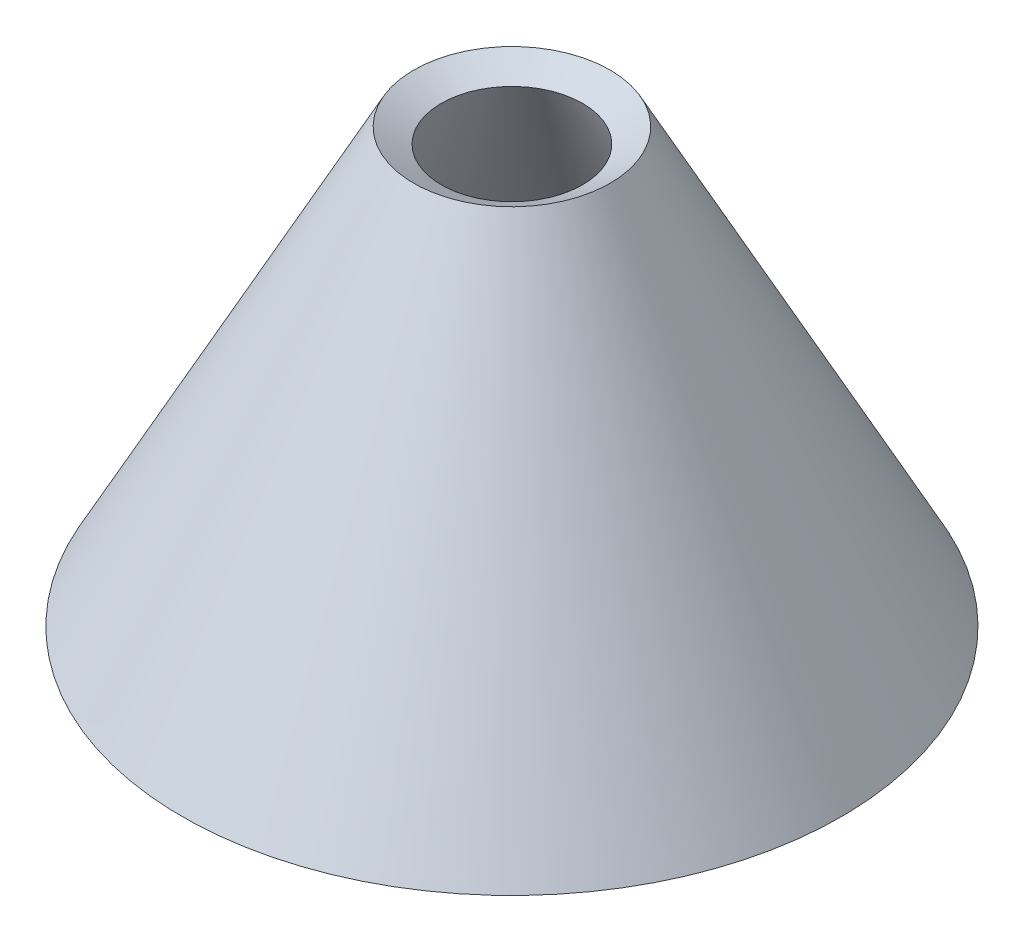
ISO-10303-21;
HEADER;
FILE_DESCRIPTION(('STEP AP214'),'2;1');
FILE_NAME('part.step','',(''),(''),'','','');
FILE_SCHEMA(('AUTOMOTIVE_DESIGN { 1 0 10303 214 1 1 1 1 }'));
ENDSEC;
DATA;
#1=APPLICATION_CONTEXT('core data for automotive mechanical design processes');
#2=APPLICATION_PROTOCOL_DEFINITION('international standard','automotive_design',2000,#1);
#3=PRODUCT_CONTEXT('',#1,'mechanical');
#4=PRODUCT('Part','Part','',(#3));
#5=PRODUCT_RELATED_PRODUCT_CATEGORY('part','',(#4));
#6=PRODUCT_DEFINITION_FORMATION('','',#4);
#7=PRODUCT_DEFINITION_CONTEXT('part definition',#1,'design');
#8=PRODUCT_DEFINITION('design','',#6,#7);
#9=PRODUCT_DEFINITION_SHAPE('','',#8);
#10=(LENGTH_UNIT() NAMED_UNIT(*) SI_UNIT(.MILLI.,.METRE.));
#11=(NAMED_UNIT(*) PLANE_ANGLE_UNIT() SI_UNIT($,.RADIAN.));
#12=(NAMED_UNIT(*) SI_UNIT($,.STERADIAN.) SOLID_ANGLE_UNIT());
#13=UNCERTAINTY_MEASURE_WITH_UNIT(LENGTH_MEASURE(1.E-05),#10,'distance_accuracy_value','');
#14=(GEOMETRIC_REPRESENTATION_CONTEXT(3) GLOBAL_UNCERTAINTY_ASSIGNED_CONTEXT((#13)) GLOBAL_UNIT_ASSIGNED_CONTEXT((#10,
#11,#12)) REPRESENTATION_CONTEXT('',''));
#15=CARTESIAN_POINT('',(0.,0.,0.));
#16=DIRECTION('',(0.,0.,1.));
#17=DIRECTION('',(1.,0.,0.));
#18=AXIS2_PLACEMENT_3D('',#15,#16,#17);
#19=CARTESIAN_POINT('',(0.,13.563350188733,0.));
#20=DIRECTION('',(0.,1.,0.));
#21=DIRECTION('',(0.,0.,1.));
#22=AXIS2_PLACEMENT_3D('',#19,#20,#21);
#23=CONICAL_SURFACE('',#22,4.5,1.06927882188576);
#24=CARTESIAN_POINT('',(0.,14.5248636325798,0.));
#25=DIRECTION('',(0.,1.,0.));
#26=DIRECTION('',(0.,0.,1.));
#27=AXIS2_PLACEMENT_3D('',#24,#25,#26);
#28=CIRCLE('',#27,6.25370804220711);
#29=CARTESIAN_POINT('',(0.,14.5248636325798,-6.25370804220711));
#30=VERTEX_POINT('',#29);
#31=EDGE_CURVE('E44',#30,#30,#28,.T.);
#32=ORIENTED_EDGE('',*,*,#31,.T.);
#33=EDGE_LOOP('',(#32));
#34=FACE_BOUND('',#33,.T.);
#35=CARTESIAN_POINT('',(0.,13.563350188733,0.));
#36=DIRECTION('',(0.,1.,0.));
#37=DIRECTION('',(0.,0.,1.));
#38=AXIS2_PLACEMENT_3D('',#35,#36,#37);
#39=CIRCLE('',#38,4.5);
#40=CARTESIAN_POINT('',(0.,13.563350188733,-4.5));
#41=VERTEX_POINT('',#40);
#42=EDGE_CURVE('E10',#41,#41,#39,.T.);
#43=ORIENTED_EDGE('',*,*,#42,.F.);
#44=EDGE_LOOP('',(#43));
#45=FACE_BOUND('',#44,.T.);
#46=ADVANCED_FACE('F30',(#34,#45),#23,.F.);
#47=CARTESIAN_POINT('',(0.,-13.9905900699163,0.));
#48=DIRECTION('',(0.,-1.,0.));
#49=DIRECTION('',(0.,0.,-1.));
#50=AXIS2_PLACEMENT_3D('',#47,#48,#49);
#51=CONICAL_SURFACE('',#50,19.2318096432382,0.49098454725863);
#52=CARTESIAN_POINT('',(0.,-13.9905900699163,0.));
#53=DIRECTION('',(0.,1.,0.));
#54=DIRECTION('',(0.,0.,1.));
#55=AXIS2_PLACEMENT_3D('',#52,#53,#54);
#56=CIRCLE('',#55,19.2318096432382);
#57=CARTESIAN_POINT('',(0.,-13.9905900699163,-19.2318096432382));
#58=VERTEX_POINT('',#57);
#59=EDGE_CURVE('E36',#58,#58,#56,.T.);
#60=CARTESIAN_POINT('',(0.,13.563350188733,-4.5));
#61=CARTESIAN_POINT('',(0.,13.2763299777054,-4.6534563504504));
#62=CARTESIAN_POINT('',(0.,12.9893097666778,-4.80691270090079));
#63=CARTESIAN_POINT('',(0.,12.4152693446226,-5.11382540180159));
#64=CARTESIAN_POINT('',(0.,12.128249133595,-5.26728175225198));
#65=CARTESIAN_POINT('',(0.,11.5542087115398,-5.57419445315278));
#66=CARTESIAN_POINT('',(0.,11.2671885005122,-5.72765080360318));
#67=CARTESIAN_POINT('',(0.,10.693148078457,-6.03456350450397));
#68=CARTESIAN_POINT('',(0.,10.4061278674294,-6.18801985495437));
#69=CARTESIAN_POINT('',(0.,9.83208744537422,-6.49493255585517));
#70=CARTESIAN_POINT('',(0.,9.54506723434663,-6.64838890630557));
#71=CARTESIAN_POINT('',(0.,8.97102681229144,-6.95530160720636));
#72=CARTESIAN_POINT('',(0.,8.68400660126384,-7.10875795765676));
#73=CARTESIAN_POINT('',(0.,8.10996617920865,-7.41567065855755));
#74=CARTESIAN_POINT('',(0.,7.82294596818105,-7.56912700900795));
#75=CARTESIAN_POINT('',(0.,7.24890554612586,-7.87603970990874));
#76=CARTESIAN_POINT('',(0.,6.96188533509826,-8.02949606035914));
#77=CARTESIAN_POINT('',(0.,6.38784491304307,-8.33640876125994));
#78=CARTESIAN_POINT('',(0.,6.10082470201547,-8.48986511171034));
#79=CARTESIAN_POINT('',(0.,5.52678427996028,-8.79677781261113));
#80=CARTESIAN_POINT('',(0.,5.23976406893268,-8.95023416306153));
#81=CARTESIAN_POINT('',(0.,4.66572364687749,-9.25714686396232));
#82=CARTESIAN_POINT('',(0.,4.3787034358499,-9.41060321441272));
#83=CARTESIAN_POINT('',(0.,3.8046630137947,-9.71751591531352));
#84=CARTESIAN_POINT('',(0.,3.51764280276711,-9.87097226576391));
#85=CARTESIAN_POINT('',(0.,2.94360238071192,-10.1778849666647));
#86=CARTESIAN_POINT('',(0.,2.65658216968432,-10.3313413171151));
#87=CARTESIAN_POINT('',(0.,2.08254174762913,-10.6382540180159));
#88=CARTESIAN_POINT('',(0.,1.79552153660153,-10.7917103684663));
#89=CARTESIAN_POINT('',(0.,1.22148111454634,-11.0986230693671));
#90=CARTESIAN_POINT('',(0.,0.934460903518742,-11.2520794198175));
#91=CARTESIAN_POINT('',(0.,0.360420481463549,-11.5589921207183));
#92=CARTESIAN_POINT('',(0.,0.0734002704359531,-11.7124484711687));
#93=CARTESIAN_POINT('',(0.,-0.500640151619239,-12.0193611720695));
#94=CARTESIAN_POINT('',(0.,-0.787660362646835,-12.1728175225199));
#95=CARTESIAN_POINT('',(0.,-1.36170078470203,-12.4797302234207));
#96=CARTESIAN_POINT('',(0.,-1.64872099572962,-12.6331865738711));
#97=CARTESIAN_POINT('',(0.,-2.22276141778482,-12.9400992747719));
#98=CARTESIAN_POINT('',(0.,-2.50978162881241,-13.0935556252223));
#99=CARTESIAN_POINT('',(0.,-3.08382205086761,-13.4004683261231));
#100=CARTESIAN_POINT('',(0.,-3.3708422618952,-13.5539246765735));
#101=CARTESIAN_POINT('',(0.,-3.94488268395039,-13.8608373774743));
#102=CARTESIAN_POINT('',(0.,-4.23190289497799,-14.0142937279246));
#103=CARTESIAN_POINT('',(0.,-4.80594331703318,-14.3212064288254));
#104=CARTESIAN_POINT('',(0.,-5.09296352806078,-14.4746627792758));
#105=CARTESIAN_POINT('',(0.,-5.66700395011597,-14.7815754801766));
#106=CARTESIAN_POINT('',(0.,-5.95402416114356,-14.935031830627));
#107=CARTESIAN_POINT('',(0.,-6.52806458319876,-15.2419445315278));
#108=CARTESIAN_POINT('',(0.,-6.81508479422635,-15.3954008819782));
#109=CARTESIAN_POINT('',(0.,-7.38912521628155,-15.702313582879));
#110=CARTESIAN_POINT('',(0.,-7.67614542730914,-15.8557699333294));
#111=CARTESIAN_POINT('',(0.,-8.25018584936434,-16.1626826342302));
#112=CARTESIAN_POINT('',(0.,-8.53720606039193,-16.3161389846806));
#113=CARTESIAN_POINT('',(0.,-9.11124648244712,-16.6230516855814));
#114=CARTESIAN_POINT('',(0.,-9.39826669347472,-16.7765080360318));
#115=CARTESIAN_POINT('',(0.,-9.97230711552991,-17.0834207369326));
#116=CARTESIAN_POINT('',(0.,-10.2593273265575,-17.236877087383));
#117=CARTESIAN_POINT('',(0.,-10.8333677486127,-17.5437897882838));
#118=CARTESIAN_POINT('',(0.,-11.1203879596403,-17.6972461387342));
#119=CARTESIAN_POINT('',(0.,-11.6944283816955,-18.004158839635));
#120=CARTESIAN_POINT('',(0.,-11.9814485927231,-18.1576151900854));
#121=CARTESIAN_POINT('',(0.,-12.5554890147783,-18.4645278909862));
#122=CARTESIAN_POINT('',(0.,-12.8425092258059,-18.6179842414366));
#123=CARTESIAN_POINT('',(0.,-13.4165496478611,-18.9248969423374));
#124=CARTESIAN_POINT('',(0.,-13.7035698588887,-19.0783532927878));
#125=CARTESIAN_POINT('',(0.,-13.9905900699163,-19.2318096432382));
#126=B_SPLINE_CURVE_WITH_KNOTS('',3,(#60,#61,#62,#63,#64,#65,#66,#67,#68,#69,#70,#71,#72,#73,
#74,#75,#76,#77,#78,#79,#80,#81,#82,#83,#84,#85,#86,#87,#88,#89,#90,#91,#92,#93,#94,#95,#96,#97,
#98,#99,#100,#101,#102,#103,#104,#105,#106,#107,#108,#109,#110,#111,#112,#113,#114,#115,#116,
#117,#118,#119,#120,#121,#122,#123,#124,#125),.UNSPECIFIED.,.F.,.F.,(4,2,2,2,2,2,2,2,2,2,2,2,2,
2,2,2,2,2,2,2,2,2,2,2,2,2,2,2,2,2,2,2,4),(0.,0.976404156733741,1.95280831346748,
2.92921247020123,3.90561662693497,4.88202078366871,5.85842494040245,6.83482909713619,
7.81123325386994,8.78763741060368,9.76404156733742,10.7404457240712,11.7168498808049,
12.6932540375386,13.6696581942724,14.6460623510061,15.6224665077399,16.5988706644736,
17.5752748212074,18.5516789779411,19.5280831346748,20.5044872914086,21.4808914481423,
22.4572956048761,23.4336997616098,24.4101039183435,25.3865080750773,26.362912231811,
27.3393163885448,28.3157205452785,29.2921247020123,30.268528858746,31.2449330154797),.UNSPECIFIED.);
#127=EDGE_CURVE('BSEAM60',#41,#58,#126,.T.);
#128=ORIENTED_EDGE('',*,*,#42,.T.);
#129=ORIENTED_EDGE('',*,*,#59,.F.);
#130=ORIENTED_EDGE('',*,*,#127,.T.);
#131=ORIENTED_EDGE('',*,*,#127,.F.);
#132=EDGE_LOOP('',(#128,#130,#129,#131));
#133=FACE_BOUND('',#132,.T.);
#134=ADVANCED_FACE('F60',(#133),#51,.F.);
#135=CARTESIAN_POINT('',(0.,-13.0476536618615,0.));
#136=DIRECTION('',(0.,1.,0.));
#137=DIRECTION('',(0.,0.,1.));
#138=AXIS2_PLACEMENT_3D('',#135,#136,#137);
#139=CONICAL_SURFACE('',#138,20.9954499620073,1.07981177953627);
#140=ORIENTED_EDGE('',*,*,#59,.T.);
#141=EDGE_LOOP('',(#140));
#142=FACE_BOUND('',#141,.T.);
#143=CARTESIAN_POINT('',(0.,-13.0476536618615,0.));
#144=DIRECTION('',(0.,1.,0.));
#145=DIRECTION('',(0.,0.,1.));
#146=AXIS2_PLACEMENT_3D('',#143,#144,#145);
#147=CIRCLE('',#146,20.9954499620073);
#148=CARTESIAN_POINT('',(0.,-13.0476536618615,-20.9954499620073));
#149=VERTEX_POINT('',#148);
#150=EDGE_CURVE('E40',#149,#149,#147,.T.);
#151=ORIENTED_EDGE('',*,*,#150,.F.);
#152=EDGE_LOOP('',(#151));
#153=FACE_BOUND('',#152,.T.);
#154=ADVANCED_FACE('F54',(#142,#153),#139,.T.);
#155=CARTESIAN_POINT('',(0.,14.5248636325798,0.));
#156=DIRECTION('',(0.,-1.,0.));
#157=DIRECTION('',(0.,0.,-1.));
#158=AXIS2_PLACEMENT_3D('',#155,#156,#157);
#159=CONICAL_SURFACE('',#158,6.25370804220711,0.49098454725863);
#160=CARTESIAN_POINT('',(0.,-13.0476536618615,-20.9954499620073));
#161=CARTESIAN_POINT('',(0.,-12.7604399400444,-20.8418901503428));
#162=CARTESIAN_POINT('',(0.,-12.4732262182273,-20.6883303386782));
#163=CARTESIAN_POINT('',(0.,-11.8987987745931,-20.381210715349));
#164=CARTESIAN_POINT('',(0.,-11.611585052776,-20.2276509036844));
#165=CARTESIAN_POINT('',(0.,-11.0371576091418,-19.9205312803552));
#166=CARTESIAN_POINT('',(0.,-10.7499438873247,-19.7669714686907));
#167=CARTESIAN_POINT('',(0.,-10.1755164436905,-19.4598518453615));
#168=CARTESIAN_POINT('',(0.,-9.8883027218734,-19.3062920336969));
#169=CARTESIAN_POINT('',(0.,-9.31387527823921,-18.9991724103677));
#170=CARTESIAN_POINT('',(0.,-9.02666155642211,-18.8456125987031));
#171=CARTESIAN_POINT('',(0.,-8.45223411278792,-18.538492975374));
#172=CARTESIAN_POINT('',(0.,-8.16502039097082,-18.3849331637094));
#173=CARTESIAN_POINT('',(0.,-7.59059294733663,-18.0778135403802));
#174=CARTESIAN_POINT('',(0.,-7.30337922551954,-17.9242537287156));
#175=CARTESIAN_POINT('',(0.,-6.72895178188534,-17.6171341053865));
#176=CARTESIAN_POINT('',(0.,-6.44173806006825,-17.4635742937219));
#177=CARTESIAN_POINT('',(0.,-5.86731061643405,-17.1564546703927));
#178=CARTESIAN_POINT('',(0.,-5.58009689461696,-17.0028948587281));
#179=CARTESIAN_POINT('',(0.,-5.00566945098277,-16.6957752353989));
#180=CARTESIAN_POINT('',(0.,-4.71845572916567,-16.5422154237344));
#181=CARTESIAN_POINT('',(0.,-4.14402828553148,-16.2350958004052));
#182=CARTESIAN_POINT('',(0.,-3.85681456371438,-16.0815359887406));
#183=CARTESIAN_POINT('',(0.,-3.28238712008019,-15.7744163654114));
#184=CARTESIAN_POINT('',(0.,-2.9951733982631,-15.6208565537468));
#185=CARTESIAN_POINT('',(0.,-2.42074595462891,-15.3137369304177));
#186=CARTESIAN_POINT('',(0.,-2.13353223281181,-15.1601771187531));
#187=CARTESIAN_POINT('',(0.,-1.55910478917762,-14.8530574954239));
#188=CARTESIAN_POINT('',(0.,-1.27189106736052,-14.6994976837593));
#189=CARTESIAN_POINT('',(0.,-0.697463623726331,-14.3923780604302));
#190=CARTESIAN_POINT('',(0.,-0.410249901909235,-14.2388182487656));
#191=CARTESIAN_POINT('',(0.,0.164177541724957,-13.9316986254364));
#192=CARTESIAN_POINT('',(0.,0.451391263542053,-13.7781388137718));
#193=CARTESIAN_POINT('',(0.,1.02581870717624,-13.4710191904426));
#194=CARTESIAN_POINT('',(0.,1.31303242899334,-13.3174593787781));
#195=CARTESIAN_POINT('',(0.,1.88745987262753,-13.0103397554489));
#196=CARTESIAN_POINT('',(0.,2.17467359444463,-12.8567799437843));
#197=CARTESIAN_POINT('',(0.,2.74910103807882,-12.5496603204551));
#198=CARTESIAN_POINT('',(0.,3.03631475989592,-12.3961005087905));
#199=CARTESIAN_POINT('',(0.,3.61074220353011,-12.0889808854614));
#200=CARTESIAN_POINT('',(0.,3.8979559253472,-11.9354210737968));
#201=CARTESIAN_POINT('',(0.,4.4723833689814,-11.6283014504676));
#202=CARTESIAN_POINT('',(0.,4.75959709079849,-11.474741638803));
#203=CARTESIAN_POINT('',(0.,5.33402453443268,-11.1676220154739));
#204=CARTESIAN_POINT('',(0.,5.62123825624978,-11.0140622038093));
#205=CARTESIAN_POINT('',(0.,6.19566569988397,-10.7069425804801));
#206=CARTESIAN_POINT('',(0.,6.48287942170107,-10.5533827688155));
#207=CARTESIAN_POINT('',(0.,7.05730686533526,-10.2462631454863));
#208=CARTESIAN_POINT('',(0.,7.34452058715235,-10.0927033338218));
#209=CARTESIAN_POINT('',(0.,7.91894803078654,-9.78558371049258));
#210=CARTESIAN_POINT('',(0.,8.20616175260364,-9.632023898828));
#211=CARTESIAN_POINT('',(0.,8.78058919623783,-9.32490427549883));
#212=CARTESIAN_POINT('',(0.,9.06780291805493,-9.17134446383424));
#213=CARTESIAN_POINT('',(0.,9.64223036168912,-8.86422484050507));
#214=CARTESIAN_POINT('',(0.,9.92944408350622,-8.71066502884048));
#215=CARTESIAN_POINT('',(0.,10.5038715271404,-8.40354540551131));
#216=CARTESIAN_POINT('',(0.,10.7910852489575,-8.24998559384673));
#217=CARTESIAN_POINT('',(0.,11.3655126925917,-7.94286597051756));
#218=CARTESIAN_POINT('',(0.,11.6527264144088,-7.78930615885297));
#219=CARTESIAN_POINT('',(0.,12.227153858043,-7.4821865355238));
#220=CARTESIAN_POINT('',(0.,12.5143675798601,-7.32862672385921));
#221=CARTESIAN_POINT('',(0.,13.0887950234943,-7.02150710053004));
#222=CARTESIAN_POINT('',(0.,13.3760087453114,-6.86794728886546));
#223=CARTESIAN_POINT('',(0.,13.9504361889456,-6.56082766553628));
#224=CARTESIAN_POINT('',(0.,14.2376499107627,-6.4072678538717));
#225=CARTESIAN_POINT('',(0.,14.5248636325798,-6.25370804220711));
#226=B_SPLINE_CURVE_WITH_KNOTS('',3,(#160,#161,#162,#163,#164,#165,#166,#167,#168,#169,#170,
#171,#172,#173,#174,#175,#176,#177,#178,#179,#180,#181,#182,#183,#184,#185,#186,#187,#188,#189,
#190,#191,#192,#193,#194,#195,#196,#197,#198,#199,#200,#201,#202,#203,#204,#205,#206,#207,#208,
#209,#210,#211,#212,#213,#214,#215,#216,#217,#218,#219,#220,#221,#222,#223,#224,#225),
.UNSPECIFIED.,.F.,.F.,(4,2,2,2,2,2,2,2,2,2,2,2,2,2,2,2,2,2,2,2,2,2,2,2,2,2,2,2,2,2,2,2,4),(0.,
0.977062454414467,1.95412490882893,2.9311873632434,3.90824981765787,4.88531227207233,
5.8623747264868,6.83943718090126,7.81649963531573,8.7935620897302,9.77062454414466,
10.7476869985591,11.7247494529736,12.7018119073881,13.6788743618025,14.655936816217,
15.6329992706315,16.6100617250459,17.5871241794604,18.5641866338749,19.5412490882893,
20.5183115427038,21.4953739971182,22.4724364515327,23.4494989059472,24.4265613603616,
25.4036238147761,26.3806862691906,27.357748723605,28.3348111780195,29.311873632434,
30.2889360868484,31.2659985412629),.UNSPECIFIED.);
#227=EDGE_CURVE('BSEAM52',#149,#30,#226,.T.);
#228=ORIENTED_EDGE('',*,*,#150,.T.);
#229=ORIENTED_EDGE('',*,*,#31,.F.);
#230=ORIENTED_EDGE('',*,*,#227,.T.);
#231=ORIENTED_EDGE('',*,*,#227,.F.);
#232=EDGE_LOOP('',(#228,#230,#229,#231));
#233=FACE_BOUND('',#232,.T.);
#234=ADVANCED_FACE('F52',(#233),#159,.T.);
#235=CLOSED_SHELL('',(#46,#134,#154,#234));
#236=MANIFOLD_SOLID_BREP('B2',#235);
#237=ADVANCED_BREP_SHAPE_REPRESENTATION('',(#18,#236),#14);
#238=SHAPE_DEFINITION_REPRESENTATION(#9,#237);
ENDSEC;
END-ISO-10303-21;
